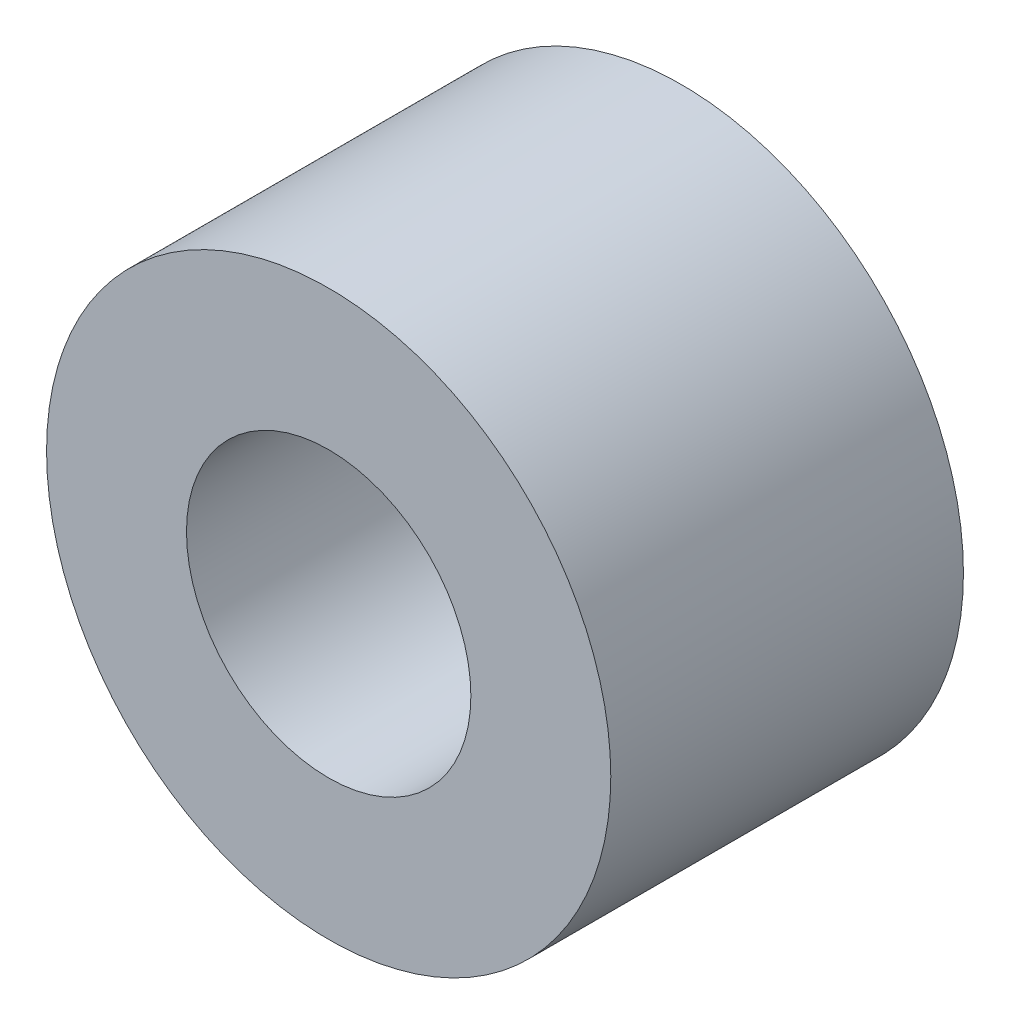
ISO-10303-21;
HEADER;
FILE_DESCRIPTION(('STEP AP214'),'2;1');
FILE_NAME('part.step','',(''),(''),'','','');
FILE_SCHEMA(('AUTOMOTIVE_DESIGN { 1 0 10303 214 1 1 1 1 }'));
ENDSEC;
DATA;
#1=APPLICATION_CONTEXT('core data for automotive mechanical design processes');
#2=APPLICATION_PROTOCOL_DEFINITION('international standard','automotive_design',2000,#1);
#3=PRODUCT_CONTEXT('',#1,'mechanical');
#4=PRODUCT('Part','Part','',(#3));
#5=PRODUCT_RELATED_PRODUCT_CATEGORY('part','',(#4));
#6=PRODUCT_DEFINITION_FORMATION('','',#4);
#7=PRODUCT_DEFINITION_CONTEXT('part definition',#1,'design');
#8=PRODUCT_DEFINITION('design','',#6,#7);
#9=PRODUCT_DEFINITION_SHAPE('','',#8);
#10=(LENGTH_UNIT() NAMED_UNIT(*) SI_UNIT(.MILLI.,.METRE.));
#11=(NAMED_UNIT(*) PLANE_ANGLE_UNIT() SI_UNIT($,.RADIAN.));
#12=(NAMED_UNIT(*) SI_UNIT($,.STERADIAN.) SOLID_ANGLE_UNIT());
#13=UNCERTAINTY_MEASURE_WITH_UNIT(LENGTH_MEASURE(1.E-05),#10,'distance_accuracy_value','');
#14=(GEOMETRIC_REPRESENTATION_CONTEXT(3) GLOBAL_UNCERTAINTY_ASSIGNED_CONTEXT((#13)) GLOBAL_UNIT_ASSIGNED_CONTEXT((#10,
#11,#12)) REPRESENTATION_CONTEXT('',''));
#15=CARTESIAN_POINT('',(0.,0.,0.));
#16=DIRECTION('',(0.,0.,1.));
#17=DIRECTION('',(1.,0.,0.));
#18=AXIS2_PLACEMENT_3D('',#15,#16,#17);
#19=CARTESIAN_POINT('',(0.,0.,3.96875));
#20=DIRECTION('',(0.,0.,1.));
#21=DIRECTION('',(1.,0.,0.));
#22=AXIS2_PLACEMENT_3D('',#19,#20,#21);
#23=PLANE('',#22);
#24=CARTESIAN_POINT('',(0.,0.,3.96875));
#25=DIRECTION('',(0.,0.,1.));
#26=DIRECTION('',(1.,0.,0.));
#27=AXIS2_PLACEMENT_3D('',#24,#25,#26);
#28=CIRCLE('',#27,6.35);
#29=CARTESIAN_POINT('',(6.35,0.,3.96875));
#30=VERTEX_POINT('',#29);
#31=EDGE_CURVE('E10',#30,#30,#28,.T.);
#32=ORIENTED_EDGE('',*,*,#31,.T.);
#33=EDGE_LOOP('',(#32));
#34=FACE_BOUND('',#33,.T.);
#35=CARTESIAN_POINT('',(0.,0.,3.96875));
#36=DIRECTION('',(0.,0.,1.));
#37=DIRECTION('',(1.,0.,0.));
#38=AXIS2_PLACEMENT_3D('',#35,#36,#37);
#39=CIRCLE('',#38,3.2004);
#40=CARTESIAN_POINT('',(3.2004,0.,3.96875));
#41=VERTEX_POINT('',#40);
#42=EDGE_CURVE('E43',#41,#41,#39,.T.);
#43=ORIENTED_EDGE('',*,*,#42,.F.);
#44=EDGE_LOOP('',(#43));
#45=FACE_BOUND('',#44,.T.);
#46=ADVANCED_FACE('F32',(#34,#45),#23,.T.);
#47=CARTESIAN_POINT('',(0.,0.,-3.96875));
#48=DIRECTION('',(0.,0.,1.));
#49=DIRECTION('',(1.,0.,0.));
#50=AXIS2_PLACEMENT_3D('',#47,#48,#49);
#51=PLANE('',#50);
#52=CARTESIAN_POINT('',(0.,0.,-3.96875));
#53=DIRECTION('',(0.,0.,1.));
#54=DIRECTION('',(1.,0.,0.));
#55=AXIS2_PLACEMENT_3D('',#52,#53,#54);
#56=CIRCLE('',#55,6.35);
#57=CARTESIAN_POINT('',(6.35,0.,-3.96875));
#58=VERTEX_POINT('',#57);
#59=EDGE_CURVE('E36',#58,#58,#56,.T.);
#60=ORIENTED_EDGE('',*,*,#59,.F.);
#61=EDGE_LOOP('',(#60));
#62=FACE_BOUND('',#61,.T.);
#63=CARTESIAN_POINT('',(0.,0.,-3.96875));
#64=DIRECTION('',(0.,0.,1.));
#65=DIRECTION('',(1.,0.,0.));
#66=AXIS2_PLACEMENT_3D('',#63,#64,#65);
#67=CIRCLE('',#66,3.2004);
#68=CARTESIAN_POINT('',(3.2004,0.,-3.96875));
#69=VERTEX_POINT('',#68);
#70=EDGE_CURVE('E45',#69,#69,#67,.T.);
#71=ORIENTED_EDGE('',*,*,#70,.T.);
#72=EDGE_LOOP('',(#71));
#73=FACE_BOUND('',#72,.T.);
#74=ADVANCED_FACE('F55',(#62,#73),#51,.F.);
#75=CARTESIAN_POINT('',(0.,0.,3.96875));
#76=DIRECTION('',(0.,0.,-1.));
#77=DIRECTION('',(-1.,0.,0.));
#78=AXIS2_PLACEMENT_3D('',#75,#76,#77);
#79=CYLINDRICAL_SURFACE('',#78,6.35);
#80=ORIENTED_EDGE('',*,*,#31,.F.);
#81=EDGE_LOOP('',(#80));
#82=FACE_BOUND('',#81,.T.);
#83=ORIENTED_EDGE('',*,*,#59,.T.);
#84=EDGE_LOOP('',(#83));
#85=FACE_BOUND('',#84,.T.);
#86=ADVANCED_FACE('F34',(#82,#85),#79,.T.);
#87=CARTESIAN_POINT('',(0.,0.,3.96875));
#88=DIRECTION('',(0.,0.,-1.));
#89=DIRECTION('',(-1.,0.,0.));
#90=AXIS2_PLACEMENT_3D('',#87,#88,#89);
#91=CYLINDRICAL_SURFACE('',#90,3.2004);
#92=ORIENTED_EDGE('',*,*,#42,.T.);
#93=EDGE_LOOP('',(#92));
#94=FACE_BOUND('',#93,.T.);
#95=ORIENTED_EDGE('',*,*,#70,.F.);
#96=EDGE_LOOP('',(#95));
#97=FACE_BOUND('',#96,.T.);
#98=ADVANCED_FACE('F51',(#94,#97),#91,.F.);
#99=CLOSED_SHELL('',(#46,#74,#86,#98));
#100=MANIFOLD_SOLID_BREP('B2',#99);
#101=ADVANCED_BREP_SHAPE_REPRESENTATION('',(#18,#100),#14);
#102=SHAPE_DEFINITION_REPRESENTATION(#9,#101);
ENDSEC;
END-ISO-10303-21;
